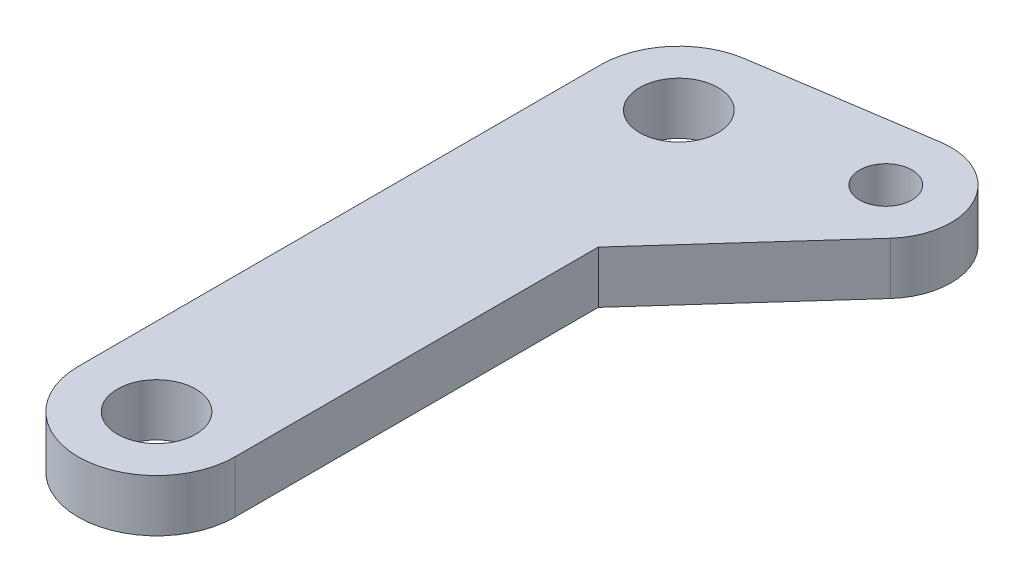
ISO-10303-21;
HEADER;
FILE_DESCRIPTION(('STEP AP214'),'2;1');
FILE_NAME('part.step','',(''),(''),'','','');
FILE_SCHEMA(('AUTOMOTIVE_DESIGN { 1 0 10303 214 1 1 1 1 }'));
ENDSEC;
DATA;
#1=APPLICATION_CONTEXT('core data for automotive mechanical design processes');
#2=APPLICATION_PROTOCOL_DEFINITION('international standard','automotive_design',2000,#1);
#3=PRODUCT_CONTEXT('',#1,'mechanical');
#4=PRODUCT('Part','Part','',(#3));
#5=PRODUCT_RELATED_PRODUCT_CATEGORY('part','',(#4));
#6=PRODUCT_DEFINITION_FORMATION('','',#4);
#7=PRODUCT_DEFINITION_CONTEXT('part definition',#1,'design');
#8=PRODUCT_DEFINITION('design','',#6,#7);
#9=PRODUCT_DEFINITION_SHAPE('','',#8);
#10=(LENGTH_UNIT() NAMED_UNIT(*) SI_UNIT(.MILLI.,.METRE.));
#11=(NAMED_UNIT(*) PLANE_ANGLE_UNIT() SI_UNIT($,.RADIAN.));
#12=(NAMED_UNIT(*) SI_UNIT($,.STERADIAN.) SOLID_ANGLE_UNIT());
#13=UNCERTAINTY_MEASURE_WITH_UNIT(LENGTH_MEASURE(1.E-05),#10,'distance_accuracy_value','');
#14=(GEOMETRIC_REPRESENTATION_CONTEXT(3) GLOBAL_UNCERTAINTY_ASSIGNED_CONTEXT((#13)) GLOBAL_UNIT_ASSIGNED_CONTEXT((#10,
#11,#12)) REPRESENTATION_CONTEXT('',''));
#15=CARTESIAN_POINT('',(0.,0.,0.));
#16=DIRECTION('',(0.,0.,1.));
#17=DIRECTION('',(1.,0.,0.));
#18=AXIS2_PLACEMENT_3D('',#15,#16,#17);
#19=CARTESIAN_POINT('',(0.,2.,0.));
#20=DIRECTION('',(0.,1.,0.));
#21=DIRECTION('',(0.,0.,1.));
#22=AXIS2_PLACEMENT_3D('',#19,#20,#21);
#23=PLANE('',#22);
#24=DIRECTION('',(0.,0.,-1.));
#25=VECTOR('',#24,1.);
#26=CARTESIAN_POINT('',(3.,2.,0.));
#27=LINE('',#26,#25);
#28=CARTESIAN_POINT('',(3.,2.,0.));
#29=VERTEX_POINT('',#28);
#30=CARTESIAN_POINT('',(3.,2.,-13.9144750378864));
#31=VERTEX_POINT('',#30);
#32=EDGE_CURVE('E145',#29,#31,#27,.T.);
#33=ORIENTED_EDGE('',*,*,#32,.T.);
#34=DIRECTION('',(0.668982950492803,0.,-0.7432777488597));
#35=VECTOR('',#34,1.);
#36=CARTESIAN_POINT('',(8.30385042878421,2.,-19.8073516860749));
#37=LINE('',#36,#35);
#38=CARTESIAN_POINT('',(8.30385042878421,2.,-19.8073516860749));
#39=VERTEX_POINT('',#38);
#40=EDGE_CURVE('E102',#31,#39,#37,.T.);
#41=ORIENTED_EDGE('',*,*,#40,.T.);
#42=CARTESIAN_POINT('',(6.44565605663496,2.,-21.4798090623069));
#43=DIRECTION('',(0.,1.,0.));
#44=DIRECTION('',(0.,0.,1.));
#45=AXIS2_PLACEMENT_3D('',#42,#43,#44);
#46=CIRCLE('',#45,2.5);
#47=CARTESIAN_POINT('',(6.0720736210984,2.,-23.9517387060991));
#48=VERTEX_POINT('',#47);
#49=EDGE_CURVE('E96',#39,#48,#46,.T.);
#50=ORIENTED_EDGE('',*,*,#49,.T.);
#51=DIRECTION('',(-0.988771857516875,0.,0.149432974214625));
#52=VECTOR('',#51,1.);
#53=CARTESIAN_POINT('',(6.0720736210984,2.,-23.9517387060991));
#54=LINE('',#53,#52);
#55=CARTESIAN_POINT('',(-0.448298922643874,2.,-22.9663155725506));
#56=VERTEX_POINT('',#55);
#57=EDGE_CURVE('E106',#48,#56,#54,.T.);
#58=ORIENTED_EDGE('',*,*,#57,.T.);
#59=CARTESIAN_POINT('',(0.,2.,-20.));
#60=DIRECTION('',(0.,1.,0.));
#61=DIRECTION('',(0.,0.,1.));
#62=AXIS2_PLACEMENT_3D('',#59,#60,#61);
#63=CIRCLE('',#62,3.);
#64=CARTESIAN_POINT('',(-3.,2.,-20.));
#65=VERTEX_POINT('',#64);
#66=EDGE_CURVE('E148',#56,#65,#63,.T.);
#67=ORIENTED_EDGE('',*,*,#66,.T.);
#68=DIRECTION('',(0.,0.,1.));
#69=VECTOR('',#68,1.);
#70=CARTESIAN_POINT('',(-3.,2.,-20.));
#71=LINE('',#70,#69);
#72=CARTESIAN_POINT('',(-3.,2.,0.));
#73=VERTEX_POINT('',#72);
#74=EDGE_CURVE('E150',#65,#73,#71,.T.);
#75=ORIENTED_EDGE('',*,*,#74,.T.);
#76=CARTESIAN_POINT('',(0.,2.,0.));
#77=DIRECTION('',(0.,1.,0.));
#78=DIRECTION('',(0.,0.,1.));
#79=AXIS2_PLACEMENT_3D('',#76,#77,#78);
#80=CIRCLE('',#79,3.);
#81=EDGE_CURVE('E142',#73,#29,#80,.T.);
#82=ORIENTED_EDGE('',*,*,#81,.T.);
#83=EDGE_LOOP('',(#33,#41,#50,#58,#67,#75,#82));
#84=FACE_BOUND('',#83,.T.);
#85=CARTESIAN_POINT('',(0.,2.,0.));
#86=DIRECTION('',(0.,1.,0.));
#87=DIRECTION('',(0.,0.,1.));
#88=AXIS2_PLACEMENT_3D('',#85,#86,#87);
#89=CIRCLE('',#88,1.5);
#90=CARTESIAN_POINT('',(0.,2.,1.5));
#91=VERTEX_POINT('',#90);
#92=EDGE_CURVE('E136',#91,#91,#89,.T.);
#93=ORIENTED_EDGE('',*,*,#92,.F.);
#94=EDGE_LOOP('',(#93));
#95=FACE_BOUND('',#94,.T.);
#96=CARTESIAN_POINT('',(0.,2.,-20.));
#97=DIRECTION('',(0.,1.,0.));
#98=DIRECTION('',(0.,0.,1.));
#99=AXIS2_PLACEMENT_3D('',#96,#97,#98);
#100=CIRCLE('',#99,1.5);
#101=CARTESIAN_POINT('',(0.,2.,-18.5));
#102=VERTEX_POINT('',#101);
#103=EDGE_CURVE('E130',#102,#102,#100,.T.);
#104=ORIENTED_EDGE('',*,*,#103,.F.);
#105=EDGE_LOOP('',(#104));
#106=FACE_BOUND('',#105,.T.);
#107=CARTESIAN_POINT('',(6.44565605663496,2.,-21.4798090623069));
#108=DIRECTION('',(0.,1.,0.));
#109=DIRECTION('',(0.,0.,1.));
#110=AXIS2_PLACEMENT_3D('',#107,#108,#109);
#111=CIRCLE('',#110,1.);
#112=CARTESIAN_POINT('',(6.44565605663496,2.,-20.4798090623069));
#113=VERTEX_POINT('',#112);
#114=EDGE_CURVE('E113',#113,#113,#111,.T.);
#115=ORIENTED_EDGE('',*,*,#114,.F.);
#116=EDGE_LOOP('',(#115));
#117=FACE_BOUND('',#116,.T.);
#118=ADVANCED_FACE('F33',(#84,#95,#106,#117),#23,.T.);
#119=CARTESIAN_POINT('',(0.,0.,0.));
#120=DIRECTION('',(0.,1.,0.));
#121=DIRECTION('',(0.,0.,1.));
#122=AXIS2_PLACEMENT_3D('',#119,#120,#121);
#123=PLANE('',#122);
#124=CARTESIAN_POINT('',(0.,0.,0.));
#125=DIRECTION('',(0.,1.,0.));
#126=DIRECTION('',(0.,0.,1.));
#127=AXIS2_PLACEMENT_3D('',#124,#125,#126);
#128=CIRCLE('',#127,3.);
#129=CARTESIAN_POINT('',(-3.,0.,0.));
#130=VERTEX_POINT('',#129);
#131=CARTESIAN_POINT('',(3.,0.,0.));
#132=VERTEX_POINT('',#131);
#133=EDGE_CURVE('E139',#130,#132,#128,.T.);
#134=ORIENTED_EDGE('',*,*,#133,.F.);
#135=DIRECTION('',(0.,0.,1.));
#136=VECTOR('',#135,1.);
#137=CARTESIAN_POINT('',(-3.,0.,-20.));
#138=LINE('',#137,#136);
#139=CARTESIAN_POINT('',(-3.,0.,-20.));
#140=VERTEX_POINT('',#139);
#141=EDGE_CURVE('E146',#140,#130,#138,.T.);
#142=ORIENTED_EDGE('',*,*,#141,.F.);
#143=CARTESIAN_POINT('',(0.,0.,-20.));
#144=DIRECTION('',(0.,1.,0.));
#145=DIRECTION('',(0.,0.,1.));
#146=AXIS2_PLACEMENT_3D('',#143,#144,#145);
#147=CIRCLE('',#146,3.);
#148=CARTESIAN_POINT('',(-0.448298922643872,0.,-22.9663155725506));
#149=VERTEX_POINT('',#148);
#150=EDGE_CURVE('E156',#149,#140,#147,.T.);
#151=ORIENTED_EDGE('',*,*,#150,.F.);
#152=DIRECTION('',(0.988771857516875,0.,-0.149432974214625));
#153=VECTOR('',#152,1.);
#154=CARTESIAN_POINT('',(6.0720736210984,0.,-23.9517387060991));
#155=LINE('',#154,#153);
#156=CARTESIAN_POINT('',(6.0720736210984,0.,-23.9517387060991));
#157=VERTEX_POINT('',#156);
#158=EDGE_CURVE('E129',#149,#157,#155,.T.);
#159=ORIENTED_EDGE('',*,*,#158,.T.);
#160=CARTESIAN_POINT('',(6.44565605663496,0.,-21.4798090623069));
#161=DIRECTION('',(0.,1.,0.));
#162=DIRECTION('',(0.,0.,1.));
#163=AXIS2_PLACEMENT_3D('',#160,#161,#162);
#164=CIRCLE('',#163,2.5);
#165=CARTESIAN_POINT('',(8.30385042878421,0.,-19.8073516860749));
#166=VERTEX_POINT('',#165);
#167=EDGE_CURVE('E98',#157,#166,#164,.F.);
#168=ORIENTED_EDGE('',*,*,#167,.T.);
#169=DIRECTION('',(-0.668982950492803,0.,0.7432777488597));
#170=VECTOR('',#169,1.);
#171=CARTESIAN_POINT('',(8.30385042878421,0.,-19.8073516860749));
#172=LINE('',#171,#170);
#173=CARTESIAN_POINT('',(3.,0.,-13.9144750378864));
#174=VERTEX_POINT('',#173);
#175=EDGE_CURVE('E122',#166,#174,#172,.T.);
#176=ORIENTED_EDGE('',*,*,#175,.T.);
#177=DIRECTION('',(0.,0.,-1.));
#178=VECTOR('',#177,1.);
#179=CARTESIAN_POINT('',(3.,0.,0.));
#180=LINE('',#179,#178);
#181=EDGE_CURVE('E52',#132,#174,#180,.T.);
#182=ORIENTED_EDGE('',*,*,#181,.F.);
#183=EDGE_LOOP('',(#134,#142,#151,#159,#168,#176,#182));
#184=FACE_BOUND('',#183,.T.);
#185=CARTESIAN_POINT('',(0.,0.,0.));
#186=DIRECTION('',(0.,1.,0.));
#187=DIRECTION('',(0.,0.,1.));
#188=AXIS2_PLACEMENT_3D('',#185,#186,#187);
#189=CIRCLE('',#188,1.5);
#190=CARTESIAN_POINT('',(0.,0.,1.5));
#191=VERTEX_POINT('',#190);
#192=EDGE_CURVE('E133',#191,#191,#189,.T.);
#193=ORIENTED_EDGE('',*,*,#192,.T.);
#194=EDGE_LOOP('',(#193));
#195=FACE_BOUND('',#194,.T.);
#196=CARTESIAN_POINT('',(0.,0.,-20.));
#197=DIRECTION('',(0.,1.,0.));
#198=DIRECTION('',(0.,0.,1.));
#199=AXIS2_PLACEMENT_3D('',#196,#197,#198);
#200=CIRCLE('',#199,1.5);
#201=CARTESIAN_POINT('',(0.,0.,-18.5));
#202=VERTEX_POINT('',#201);
#203=EDGE_CURVE('E128',#202,#202,#200,.T.);
#204=ORIENTED_EDGE('',*,*,#203,.T.);
#205=EDGE_LOOP('',(#204));
#206=FACE_BOUND('',#205,.T.);
#207=CARTESIAN_POINT('',(6.44565605663496,0.,-21.4798090623069));
#208=DIRECTION('',(0.,1.,0.));
#209=DIRECTION('',(0.,0.,1.));
#210=AXIS2_PLACEMENT_3D('',#207,#208,#209);
#211=CIRCLE('',#210,1.);
#212=CARTESIAN_POINT('',(6.44565605663496,0.,-20.4798090623069));
#213=VERTEX_POINT('',#212);
#214=EDGE_CURVE('E125',#213,#213,#211,.F.);
#215=ORIENTED_EDGE('',*,*,#214,.F.);
#216=EDGE_LOOP('',(#215));
#217=FACE_BOUND('',#216,.T.);
#218=ADVANCED_FACE('F170',(#184,#195,#206,#217),#123,.F.);
#219=CARTESIAN_POINT('',(0.,2.,0.));
#220=DIRECTION('',(0.,-1.,0.));
#221=DIRECTION('',(0.,0.,-1.));
#222=AXIS2_PLACEMENT_3D('',#219,#220,#221);
#223=CYLINDRICAL_SURFACE('',#222,3.);
#224=ORIENTED_EDGE('',*,*,#133,.T.);
#225=DIRECTION('',(0.,-1.,0.));
#226=VECTOR('',#225,1.);
#227=CARTESIAN_POINT('',(3.,2.,0.));
#228=LINE('',#227,#226);
#229=EDGE_CURVE('E11',#29,#132,#228,.T.);
#230=ORIENTED_EDGE('',*,*,#229,.F.);
#231=ORIENTED_EDGE('',*,*,#81,.F.);
#232=DIRECTION('',(0.,-1.,0.));
#233=VECTOR('',#232,1.);
#234=CARTESIAN_POINT('',(-3.,2.,0.));
#235=LINE('',#234,#233);
#236=EDGE_CURVE('E152',#73,#130,#235,.T.);
#237=ORIENTED_EDGE('',*,*,#236,.T.);
#238=EDGE_LOOP('',(#224,#230,#231,#237));
#239=FACE_BOUND('',#238,.T.);
#240=ADVANCED_FACE('F35',(#239),#223,.T.);
#241=CARTESIAN_POINT('',(3.,2.,0.));
#242=DIRECTION('',(-1.,0.,0.));
#243=DIRECTION('',(0.,0.,1.));
#244=AXIS2_PLACEMENT_3D('',#241,#242,#243);
#245=PLANE('',#244);
#246=ORIENTED_EDGE('',*,*,#181,.T.);
#247=DIRECTION('',(0.,1.,0.));
#248=VECTOR('',#247,1.);
#249=CARTESIAN_POINT('',(3.,-13.7679823930696,-13.9144750378864));
#250=LINE('',#249,#248);
#251=EDGE_CURVE('E48',#174,#31,#250,.T.);
#252=ORIENTED_EDGE('',*,*,#251,.T.);
#253=ORIENTED_EDGE('',*,*,#32,.F.);
#254=ORIENTED_EDGE('',*,*,#229,.T.);
#255=EDGE_LOOP('',(#246,#252,#253,#254));
#256=FACE_BOUND('',#255,.T.);
#257=ADVANCED_FACE('F205',(#256),#245,.F.);
#258=CARTESIAN_POINT('',(0.,2.,-20.));
#259=DIRECTION('',(0.,-1.,0.));
#260=DIRECTION('',(0.,0.,-1.));
#261=AXIS2_PLACEMENT_3D('',#258,#259,#260);
#262=CYLINDRICAL_SURFACE('',#261,3.);
#263=ORIENTED_EDGE('',*,*,#66,.F.);
#264=DIRECTION('',(0.,1.,0.));
#265=VECTOR('',#264,1.);
#266=CARTESIAN_POINT('',(-0.448298922643872,-13.7679823930696,-22.9663155725506));
#267=LINE('',#266,#265);
#268=EDGE_CURVE('E101',#149,#56,#267,.T.);
#269=ORIENTED_EDGE('',*,*,#268,.F.);
#270=ORIENTED_EDGE('',*,*,#150,.T.);
#271=DIRECTION('',(0.,-1.,0.));
#272=VECTOR('',#271,1.);
#273=CARTESIAN_POINT('',(-3.,2.,-20.));
#274=LINE('',#273,#272);
#275=EDGE_CURVE('E41',#65,#140,#274,.T.);
#276=ORIENTED_EDGE('',*,*,#275,.F.);
#277=EDGE_LOOP('',(#263,#269,#270,#276));
#278=FACE_BOUND('',#277,.T.);
#279=ADVANCED_FACE('F175',(#278),#262,.T.);
#280=CARTESIAN_POINT('',(-3.,2.,-20.));
#281=DIRECTION('',(1.,0.,0.));
#282=DIRECTION('',(0.,0.,-1.));
#283=AXIS2_PLACEMENT_3D('',#280,#281,#282);
#284=PLANE('',#283);
#285=ORIENTED_EDGE('',*,*,#141,.T.);
#286=ORIENTED_EDGE('',*,*,#236,.F.);
#287=ORIENTED_EDGE('',*,*,#74,.F.);
#288=ORIENTED_EDGE('',*,*,#275,.T.);
#289=EDGE_LOOP('',(#285,#286,#287,#288));
#290=FACE_BOUND('',#289,.T.);
#291=ADVANCED_FACE('F165',(#290),#284,.F.);
#292=CARTESIAN_POINT('',(0.,2.,0.));
#293=DIRECTION('',(0.,-1.,0.));
#294=DIRECTION('',(0.,0.,-1.));
#295=AXIS2_PLACEMENT_3D('',#292,#293,#294);
#296=CYLINDRICAL_SURFACE('',#295,1.5);
#297=ORIENTED_EDGE('',*,*,#92,.T.);
#298=EDGE_LOOP('',(#297));
#299=FACE_BOUND('',#298,.T.);
#300=ORIENTED_EDGE('',*,*,#192,.F.);
#301=EDGE_LOOP('',(#300));
#302=FACE_BOUND('',#301,.T.);
#303=ADVANCED_FACE('F199',(#299,#302),#296,.F.);
#304=CARTESIAN_POINT('',(0.,2.,-20.));
#305=DIRECTION('',(0.,-1.,0.));
#306=DIRECTION('',(0.,0.,-1.));
#307=AXIS2_PLACEMENT_3D('',#304,#305,#306);
#308=CYLINDRICAL_SURFACE('',#307,1.5);
#309=ORIENTED_EDGE('',*,*,#103,.T.);
#310=EDGE_LOOP('',(#309));
#311=FACE_BOUND('',#310,.T.);
#312=ORIENTED_EDGE('',*,*,#203,.F.);
#313=EDGE_LOOP('',(#312));
#314=FACE_BOUND('',#313,.T.);
#315=ADVANCED_FACE('F189',(#311,#314),#308,.F.);
#316=CARTESIAN_POINT('',(6.0720736210984,-13.7679823930696,-23.9517387060991));
#317=DIRECTION('',(-0.149432974214625,0.,-0.988771857516875));
#318=DIRECTION('',(-0.988771857516875,0.,0.149432974214625));
#319=AXIS2_PLACEMENT_3D('',#316,#317,#318);
#320=PLANE('',#319);
#321=ORIENTED_EDGE('',*,*,#158,.F.);
#322=ORIENTED_EDGE('',*,*,#268,.T.);
#323=ORIENTED_EDGE('',*,*,#57,.F.);
#324=DIRECTION('',(0.,1.,0.));
#325=VECTOR('',#324,1.);
#326=CARTESIAN_POINT('',(6.0720736210984,-13.7679823930696,-23.9517387060991));
#327=LINE('',#326,#325);
#328=EDGE_CURVE('E91',#157,#48,#327,.T.);
#329=ORIENTED_EDGE('',*,*,#328,.F.);
#330=EDGE_LOOP('',(#321,#322,#323,#329));
#331=FACE_BOUND('',#330,.T.);
#332=ADVANCED_FACE('F107',(#331),#320,.T.);
#333=CARTESIAN_POINT('',(8.30385042878421,-13.7679823930696,-19.8073516860749));
#334=DIRECTION('',(0.7432777488597,0.,0.668982950492803));
#335=DIRECTION('',(0.668982950492803,0.,-0.7432777488597));
#336=AXIS2_PLACEMENT_3D('',#333,#334,#335);
#337=PLANE('',#336);
#338=ORIENTED_EDGE('',*,*,#175,.F.);
#339=DIRECTION('',(0.,1.,0.));
#340=VECTOR('',#339,1.);
#341=CARTESIAN_POINT('',(8.30385042878421,-13.7679823930696,-19.8073516860749));
#342=LINE('',#341,#340);
#343=EDGE_CURVE('E120',#166,#39,#342,.T.);
#344=ORIENTED_EDGE('',*,*,#343,.T.);
#345=ORIENTED_EDGE('',*,*,#40,.F.);
#346=ORIENTED_EDGE('',*,*,#251,.F.);
#347=EDGE_LOOP('',(#338,#344,#345,#346));
#348=FACE_BOUND('',#347,.T.);
#349=ADVANCED_FACE('F180',(#348),#337,.T.);
#350=CARTESIAN_POINT('',(6.44565605663496,-13.7679823930696,-21.4798090623069));
#351=DIRECTION('',(0.,1.,0.));
#352=DIRECTION('',(0.,0.,1.));
#353=AXIS2_PLACEMENT_3D('',#350,#351,#352);
#354=CYLINDRICAL_SURFACE('',#353,2.5);
#355=ORIENTED_EDGE('',*,*,#167,.F.);
#356=ORIENTED_EDGE('',*,*,#328,.T.);
#357=ORIENTED_EDGE('',*,*,#49,.F.);
#358=ORIENTED_EDGE('',*,*,#343,.F.);
#359=EDGE_LOOP('',(#355,#356,#357,#358));
#360=FACE_BOUND('',#359,.T.);
#361=ADVANCED_FACE('F93',(#360),#354,.T.);
#362=CARTESIAN_POINT('',(6.44565605663496,-13.7679823930696,-21.4798090623069));
#363=DIRECTION('',(0.,1.,0.));
#364=DIRECTION('',(0.,0.,1.));
#365=AXIS2_PLACEMENT_3D('',#362,#363,#364);
#366=CYLINDRICAL_SURFACE('',#365,1.);
#367=ORIENTED_EDGE('',*,*,#214,.T.);
#368=EDGE_LOOP('',(#367));
#369=FACE_BOUND('',#368,.T.);
#370=ORIENTED_EDGE('',*,*,#114,.T.);
#371=EDGE_LOOP('',(#370));
#372=FACE_BOUND('',#371,.T.);
#373=ADVANCED_FACE('F187',(#369,#372),#366,.F.);
#374=CLOSED_SHELL('',(#118,#218,#240,#257,#279,#291,#303,#315,#332,#349,#361,#373));
#375=MANIFOLD_SOLID_BREP('B2',#374);
#376=ADVANCED_BREP_SHAPE_REPRESENTATION('',(#18,#375),#14);
#377=SHAPE_DEFINITION_REPRESENTATION(#9,#376);
ENDSEC;
END-ISO-10303-21;
